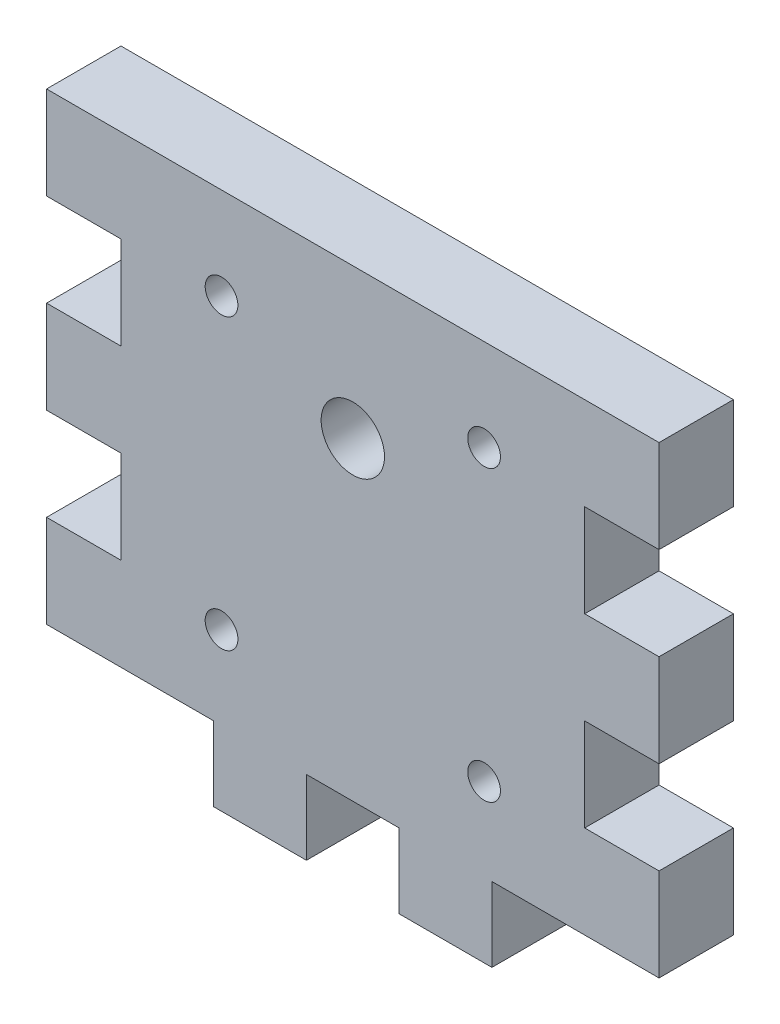
ISO-10303-21;
HEADER;
FILE_DESCRIPTION(('STEP AP214'),'2;1');
FILE_NAME('part.step','',(''),(''),'','','');
FILE_SCHEMA(('AUTOMOTIVE_DESIGN { 1 0 10303 214 1 1 1 1 }'));
ENDSEC;
DATA;
#1=APPLICATION_CONTEXT('core data for automotive mechanical design processes');
#2=APPLICATION_PROTOCOL_DEFINITION('international standard','automotive_design',2000,#1);
#3=PRODUCT_CONTEXT('',#1,'mechanical');
#4=PRODUCT('Part','Part','',(#3));
#5=PRODUCT_RELATED_PRODUCT_CATEGORY('part','',(#4));
#6=PRODUCT_DEFINITION_FORMATION('','',#4);
#7=PRODUCT_DEFINITION_CONTEXT('part definition',#1,'design');
#8=PRODUCT_DEFINITION('design','',#6,#7);
#9=PRODUCT_DEFINITION_SHAPE('','',#8);
#10=(LENGTH_UNIT() NAMED_UNIT(*) SI_UNIT(.MILLI.,.METRE.));
#11=(NAMED_UNIT(*) PLANE_ANGLE_UNIT() SI_UNIT($,.RADIAN.));
#12=(NAMED_UNIT(*) SI_UNIT($,.STERADIAN.) SOLID_ANGLE_UNIT());
#13=UNCERTAINTY_MEASURE_WITH_UNIT(LENGTH_MEASURE(1.E-05),#10,'distance_accuracy_value','');
#14=(GEOMETRIC_REPRESENTATION_CONTEXT(3) GLOBAL_UNCERTAINTY_ASSIGNED_CONTEXT((#13)) GLOBAL_UNIT_ASSIGNED_CONTEXT((#10,
#11,#12)) REPRESENTATION_CONTEXT('',''));
#15=CARTESIAN_POINT('',(0.,0.,0.));
#16=DIRECTION('',(0.,0.,1.));
#17=DIRECTION('',(1.,0.,0.));
#18=AXIS2_PLACEMENT_3D('',#15,#16,#17);
#19=CARTESIAN_POINT('',(0.,0.,6.35));
#20=DIRECTION('',(0.,0.,-1.));
#21=DIRECTION('',(-1.,0.,0.));
#22=AXIS2_PLACEMENT_3D('',#19,#20,#21);
#23=PLANE('',#22);
#24=CARTESIAN_POINT('',(3.22086547923458,-25.1066840960137,6.35));
#25=DIRECTION('',(0.,0.,1.));
#26=DIRECTION('',(1.,0.,0.));
#27=AXIS2_PLACEMENT_3D('',#24,#25,#26);
#28=CIRCLE('',#27,1.397);
#29=CARTESIAN_POINT('',(4.61786547923458,-25.1066840960137,6.35));
#30=VERTEX_POINT('',#29);
#31=EDGE_CURVE('E506',#30,#30,#28,.T.);
#32=ORIENTED_EDGE('',*,*,#31,.F.);
#33=EDGE_LOOP('',(#32));
#34=FACE_BOUND('',#33,.T.);
#35=CARTESIAN_POINT('',(25.6363977372346,-0.422913296013645,6.35));
#36=DIRECTION('',(0.,0.,1.));
#37=DIRECTION('',(1.,0.,0.));
#38=AXIS2_PLACEMENT_3D('',#35,#36,#37);
#39=CIRCLE('',#38,1.397);
#40=CARTESIAN_POINT('',(27.0333977372346,-0.422913296013645,6.35));
#41=VERTEX_POINT('',#40);
#42=EDGE_CURVE('E518',#41,#41,#39,.T.);
#43=ORIENTED_EDGE('',*,*,#42,.F.);
#44=EDGE_LOOP('',(#43));
#45=FACE_BOUND('',#44,.T.);
#46=DIRECTION('',(1.,0.,0.));
#47=VECTOR('',#46,1.);
#48=CARTESIAN_POINT('',(2.55226427643458,-38.5282508520136,6.35));
#49=LINE('',#48,#47);
#50=CARTESIAN_POINT('',(2.55226427643458,-38.5282508520136,6.35));
#51=VERTEX_POINT('',#50);
#52=CARTESIAN_POINT('',(10.4698424976346,-38.5282508520136,6.35));
#53=VERTEX_POINT('',#52);
#54=EDGE_CURVE('E307',#51,#53,#49,.T.);
#55=ORIENTED_EDGE('',*,*,#54,.T.);
#56=DIRECTION('',(0.,1.,0.));
#57=VECTOR('',#56,1.);
#58=CARTESIAN_POINT('',(10.4698424976346,-32.1782508520136,6.35));
#59=LINE('',#58,#57);
#60=CARTESIAN_POINT('',(10.4698424976346,-32.1782508520136,6.35));
#61=VERTEX_POINT('',#60);
#62=EDGE_CURVE('E153',#53,#61,#59,.T.);
#63=ORIENTED_EDGE('',*,*,#62,.T.);
#64=DIRECTION('',(1.,0.,0.));
#65=VECTOR('',#64,1.);
#66=CARTESIAN_POINT('',(10.4698424976346,-32.1782508520136,6.35));
#67=LINE('',#66,#65);
#68=CARTESIAN_POINT('',(18.3874207188346,-32.1782508520136,6.35));
#69=VERTEX_POINT('',#68);
#70=EDGE_CURVE('E382',#61,#69,#67,.T.);
#71=ORIENTED_EDGE('',*,*,#70,.T.);
#72=DIRECTION('',(0.,-1.,0.));
#73=VECTOR('',#72,1.);
#74=CARTESIAN_POINT('',(18.3874207188346,-32.1782508520136,6.35));
#75=LINE('',#74,#73);
#76=CARTESIAN_POINT('',(18.3874207188346,-38.5282508520136,6.35));
#77=VERTEX_POINT('',#76);
#78=EDGE_CURVE('E401',#69,#77,#75,.T.);
#79=ORIENTED_EDGE('',*,*,#78,.T.);
#80=DIRECTION('',(1.,0.,0.));
#81=VECTOR('',#80,1.);
#82=CARTESIAN_POINT('',(18.3874207188346,-38.5282508520136,6.35));
#83=LINE('',#82,#81);
#84=CARTESIAN_POINT('',(26.3049989400346,-38.5282508520136,6.35));
#85=VERTEX_POINT('',#84);
#86=EDGE_CURVE('E398',#77,#85,#83,.T.);
#87=ORIENTED_EDGE('',*,*,#86,.T.);
#88=DIRECTION('',(0.,1.,0.));
#89=VECTOR('',#88,1.);
#90=CARTESIAN_POINT('',(26.3049989400346,-32.1782508520136,6.35));
#91=LINE('',#90,#89);
#92=CARTESIAN_POINT('',(26.3049989400346,-32.1782508520136,6.35));
#93=VERTEX_POINT('',#92);
#94=EDGE_CURVE('E400',#85,#93,#91,.T.);
#95=ORIENTED_EDGE('',*,*,#94,.T.);
#96=DIRECTION('',(1.,0.,0.));
#97=VECTOR('',#96,1.);
#98=CARTESIAN_POINT('',(26.3049989400346,-32.1782508520136,6.35));
#99=LINE('',#98,#97);
#100=CARTESIAN_POINT('',(40.5725771612346,-32.1782508520136,6.35));
#101=VERTEX_POINT('',#100);
#102=EDGE_CURVE('E403',#93,#101,#99,.T.);
#103=ORIENTED_EDGE('',*,*,#102,.T.);
#104=DIRECTION('',(0.,1.,0.));
#105=VECTOR('',#104,1.);
#106=CARTESIAN_POINT('',(40.5725771612346,-24.2606726308136,6.35));
#107=LINE('',#106,#105);
#108=CARTESIAN_POINT('',(40.5725771612346,-24.2606726308136,6.35));
#109=VERTEX_POINT('',#108);
#110=EDGE_CURVE('E409',#101,#109,#107,.T.);
#111=ORIENTED_EDGE('',*,*,#110,.T.);
#112=DIRECTION('',(-1.,0.,0.));
#113=VECTOR('',#112,1.);
#114=CARTESIAN_POINT('',(34.2225771612346,-24.2606726308136,6.35));
#115=LINE('',#114,#113);
#116=CARTESIAN_POINT('',(34.2225771612346,-24.2606726308136,6.35));
#117=VERTEX_POINT('',#116);
#118=EDGE_CURVE('E411',#109,#117,#115,.T.);
#119=ORIENTED_EDGE('',*,*,#118,.T.);
#120=DIRECTION('',(0.,1.,0.));
#121=VECTOR('',#120,1.);
#122=CARTESIAN_POINT('',(34.2225771612346,-16.3430944096136,6.35));
#123=LINE('',#122,#121);
#124=CARTESIAN_POINT('',(34.2225771612346,-16.3430944096136,6.35));
#125=VERTEX_POINT('',#124);
#126=EDGE_CURVE('E413',#117,#125,#123,.T.);
#127=ORIENTED_EDGE('',*,*,#126,.T.);
#128=DIRECTION('',(1.,0.,0.));
#129=VECTOR('',#128,1.);
#130=CARTESIAN_POINT('',(34.2225771612346,-16.3430944096136,6.35));
#131=LINE('',#130,#129);
#132=CARTESIAN_POINT('',(40.5725771612346,-16.3430944096136,6.35));
#133=VERTEX_POINT('',#132);
#134=EDGE_CURVE('E415',#125,#133,#131,.T.);
#135=ORIENTED_EDGE('',*,*,#134,.T.);
#136=DIRECTION('',(0.,1.,0.));
#137=VECTOR('',#136,1.);
#138=CARTESIAN_POINT('',(40.5725771612346,-8.42551618841362,6.35));
#139=LINE('',#138,#137);
#140=CARTESIAN_POINT('',(40.5725771612346,-8.42551618841362,6.35));
#141=VERTEX_POINT('',#140);
#142=EDGE_CURVE('E417',#133,#141,#139,.T.);
#143=ORIENTED_EDGE('',*,*,#142,.T.);
#144=DIRECTION('',(-1.,0.,0.));
#145=VECTOR('',#144,1.);
#146=CARTESIAN_POINT('',(34.2225771612346,-8.42551618841362,6.35));
#147=LINE('',#146,#145);
#148=CARTESIAN_POINT('',(34.2225771612346,-8.42551618841362,6.35));
#149=VERTEX_POINT('',#148);
#150=EDGE_CURVE('E419',#141,#149,#147,.T.);
#151=ORIENTED_EDGE('',*,*,#150,.T.);
#152=DIRECTION('',(0.,1.,0.));
#153=VECTOR('',#152,1.);
#154=CARTESIAN_POINT('',(34.2225771612346,-0.507937967213606,6.35));
#155=LINE('',#154,#153);
#156=CARTESIAN_POINT('',(34.2225771612346,-0.507937967213606,6.35));
#157=VERTEX_POINT('',#156);
#158=EDGE_CURVE('E421',#149,#157,#155,.T.);
#159=ORIENTED_EDGE('',*,*,#158,.T.);
#160=DIRECTION('',(1.,0.,0.));
#161=VECTOR('',#160,1.);
#162=CARTESIAN_POINT('',(34.2225771612346,-0.507937967213606,6.35));
#163=LINE('',#162,#161);
#164=CARTESIAN_POINT('',(40.5725771612346,-0.507937967213622,6.35));
#165=VERTEX_POINT('',#164);
#166=EDGE_CURVE('E423',#157,#165,#163,.T.);
#167=ORIENTED_EDGE('',*,*,#166,.T.);
#168=DIRECTION('',(0.,1.,0.));
#169=VECTOR('',#168,1.);
#170=CARTESIAN_POINT('',(40.5725771612346,7.40964025398638,6.35));
#171=LINE('',#170,#169);
#172=CARTESIAN_POINT('',(40.5725771612346,7.40964025398638,6.35));
#173=VERTEX_POINT('',#172);
#174=EDGE_CURVE('E425',#165,#173,#171,.T.);
#175=ORIENTED_EDGE('',*,*,#174,.T.);
#176=DIRECTION('',(-1.,0.,0.));
#177=VECTOR('',#176,1.);
#178=CARTESIAN_POINT('',(-11.7153139447654,7.40964025398638,6.35));
#179=LINE('',#178,#177);
#180=CARTESIAN_POINT('',(-11.7153139447654,7.40964025398638,6.35));
#181=VERTEX_POINT('',#180);
#182=EDGE_CURVE('E427',#173,#181,#179,.T.);
#183=ORIENTED_EDGE('',*,*,#182,.T.);
#184=DIRECTION('',(0.,-1.,0.));
#185=VECTOR('',#184,1.);
#186=CARTESIAN_POINT('',(-11.7153139447654,7.40964025398638,6.35));
#187=LINE('',#186,#185);
#188=CARTESIAN_POINT('',(-11.7153139447654,-0.507937967213622,6.35));
#189=VERTEX_POINT('',#188);
#190=EDGE_CURVE('E429',#181,#189,#187,.T.);
#191=ORIENTED_EDGE('',*,*,#190,.T.);
#192=DIRECTION('',(1.,0.,0.));
#193=VECTOR('',#192,1.);
#194=CARTESIAN_POINT('',(-5.36531394476542,-0.507937967213605,6.35));
#195=LINE('',#194,#193);
#196=CARTESIAN_POINT('',(-5.36531394476542,-0.507937967213605,6.35));
#197=VERTEX_POINT('',#196);
#198=EDGE_CURVE('E431',#189,#197,#195,.T.);
#199=ORIENTED_EDGE('',*,*,#198,.T.);
#200=DIRECTION('',(0.,-1.,0.));
#201=VECTOR('',#200,1.);
#202=CARTESIAN_POINT('',(-5.36531394476542,-0.507937967213605,6.35));
#203=LINE('',#202,#201);
#204=CARTESIAN_POINT('',(-5.36531394476542,-8.42551618841362,6.35));
#205=VERTEX_POINT('',#204);
#206=EDGE_CURVE('E433',#197,#205,#203,.T.);
#207=ORIENTED_EDGE('',*,*,#206,.T.);
#208=DIRECTION('',(-1.,0.,0.));
#209=VECTOR('',#208,1.);
#210=CARTESIAN_POINT('',(-5.36531394476542,-8.42551618841362,6.35));
#211=LINE('',#210,#209);
#212=CARTESIAN_POINT('',(-11.7153139447654,-8.42551618841362,6.35));
#213=VERTEX_POINT('',#212);
#214=EDGE_CURVE('E435',#205,#213,#211,.T.);
#215=ORIENTED_EDGE('',*,*,#214,.T.);
#216=DIRECTION('',(0.,-1.,0.));
#217=VECTOR('',#216,1.);
#218=CARTESIAN_POINT('',(-11.7153139447654,-16.3430944096136,6.35));
#219=LINE('',#218,#217);
#220=CARTESIAN_POINT('',(-11.7153139447654,-16.3430944096136,6.35));
#221=VERTEX_POINT('',#220);
#222=EDGE_CURVE('E437',#213,#221,#219,.T.);
#223=ORIENTED_EDGE('',*,*,#222,.T.);
#224=DIRECTION('',(1.,0.,0.));
#225=VECTOR('',#224,1.);
#226=CARTESIAN_POINT('',(-5.36531394476542,-16.3430944096136,6.35));
#227=LINE('',#226,#225);
#228=CARTESIAN_POINT('',(-5.36531394476542,-16.3430944096136,6.35));
#229=VERTEX_POINT('',#228);
#230=EDGE_CURVE('E439',#221,#229,#227,.T.);
#231=ORIENTED_EDGE('',*,*,#230,.T.);
#232=DIRECTION('',(0.,-1.,0.));
#233=VECTOR('',#232,1.);
#234=CARTESIAN_POINT('',(-5.36531394476542,-16.3430944096136,6.35));
#235=LINE('',#234,#233);
#236=CARTESIAN_POINT('',(-5.36531394476542,-24.2606726308136,6.35));
#237=VERTEX_POINT('',#236);
#238=EDGE_CURVE('E441',#229,#237,#235,.T.);
#239=ORIENTED_EDGE('',*,*,#238,.T.);
#240=DIRECTION('',(-1.,0.,0.));
#241=VECTOR('',#240,1.);
#242=CARTESIAN_POINT('',(-5.36531394476542,-24.2606726308136,6.35));
#243=LINE('',#242,#241);
#244=CARTESIAN_POINT('',(-11.7153139447654,-24.2606726308136,6.35));
#245=VERTEX_POINT('',#244);
#246=EDGE_CURVE('E232',#237,#245,#243,.T.);
#247=ORIENTED_EDGE('',*,*,#246,.T.);
#248=DIRECTION('',(0.,-1.,0.));
#249=VECTOR('',#248,1.);
#250=CARTESIAN_POINT('',(-11.7153139447654,-32.1782508520136,6.35));
#251=LINE('',#250,#249);
#252=CARTESIAN_POINT('',(-11.7153139447654,-32.1782508520136,6.35));
#253=VERTEX_POINT('',#252);
#254=EDGE_CURVE('E226',#245,#253,#251,.T.);
#255=ORIENTED_EDGE('',*,*,#254,.T.);
#256=DIRECTION('',(1.,0.,0.));
#257=VECTOR('',#256,1.);
#258=CARTESIAN_POINT('',(-5.36531394476542,-32.1782508520136,6.35));
#259=LINE('',#258,#257);
#260=CARTESIAN_POINT('',(2.55226427643458,-32.1782508520136,6.35));
#261=VERTEX_POINT('',#260);
#262=EDGE_CURVE('E230',#253,#261,#259,.T.);
#263=ORIENTED_EDGE('',*,*,#262,.T.);
#264=DIRECTION('',(0.,-1.,0.));
#265=VECTOR('',#264,1.);
#266=CARTESIAN_POINT('',(2.55226427643458,-38.5282508520136,6.35));
#267=LINE('',#266,#265);
#268=EDGE_CURVE('E51',#261,#51,#267,.T.);
#269=ORIENTED_EDGE('',*,*,#268,.T.);
#270=EDGE_LOOP('',(#55,#63,#71,#79,#87,#95,#103,#111,#119,#127,#135,#143,#151,#159,#167,#175,
#183,#191,#199,#207,#215,#223,#231,#239,#247,#255,#263,#269));
#271=FACE_BOUND('',#270,.T.);
#272=CARTESIAN_POINT('',(3.22086547923459,-0.422913296013645,6.35));
#273=DIRECTION('',(0.,0.,1.));
#274=DIRECTION('',(1.,0.,0.));
#275=AXIS2_PLACEMENT_3D('',#272,#273,#274);
#276=CIRCLE('',#275,1.397);
#277=CARTESIAN_POINT('',(4.61786547923459,-0.422913296013645,6.35));
#278=VERTEX_POINT('',#277);
#279=EDGE_CURVE('E255',#278,#278,#276,.T.);
#280=ORIENTED_EDGE('',*,*,#279,.F.);
#281=EDGE_LOOP('',(#280));
#282=FACE_BOUND('',#281,.T.);
#283=CARTESIAN_POINT('',(25.6363977372346,-25.1066840960137,6.35));
#284=DIRECTION('',(0.,0.,1.));
#285=DIRECTION('',(1.,0.,0.));
#286=AXIS2_PLACEMENT_3D('',#283,#284,#285);
#287=CIRCLE('',#286,1.397);
#288=CARTESIAN_POINT('',(27.0333977372346,-25.1066840960137,6.35));
#289=VERTEX_POINT('',#288);
#290=EDGE_CURVE('E512',#289,#289,#287,.T.);
#291=ORIENTED_EDGE('',*,*,#290,.F.);
#292=EDGE_LOOP('',(#291));
#293=FACE_BOUND('',#292,.T.);
#294=CARTESIAN_POINT('',(14.4286316082346,-5.35966745601365,6.35));
#295=DIRECTION('',(0.,0.,1.));
#296=DIRECTION('',(1.,0.,0.));
#297=AXIS2_PLACEMENT_3D('',#294,#295,#296);
#298=CIRCLE('',#297,2.70409387831448);
#299=CARTESIAN_POINT('',(17.1327254865491,-5.35966745601365,6.35));
#300=VERTEX_POINT('',#299);
#301=EDGE_CURVE('E497',#300,#300,#298,.T.);
#302=ORIENTED_EDGE('',*,*,#301,.F.);
#303=EDGE_LOOP('',(#302));
#304=FACE_BOUND('',#303,.T.);
#305=ADVANCED_FACE('F34',(#34,#45,#271,#282,#293,#304),#23,.F.);
#306=CARTESIAN_POINT('',(0.,0.,0.));
#307=DIRECTION('',(0.,0.,-1.));
#308=DIRECTION('',(-1.,0.,0.));
#309=AXIS2_PLACEMENT_3D('',#306,#307,#308);
#310=PLANE('',#309);
#311=CARTESIAN_POINT('',(3.22086547923458,-25.1066840960137,0.));
#312=DIRECTION('',(0.,0.,1.));
#313=DIRECTION('',(1.,0.,0.));
#314=AXIS2_PLACEMENT_3D('',#311,#312,#313);
#315=CIRCLE('',#314,1.397);
#316=CARTESIAN_POINT('',(4.61786547923458,-25.1066840960137,0.));
#317=VERTEX_POINT('',#316);
#318=EDGE_CURVE('E503',#317,#317,#315,.T.);
#319=ORIENTED_EDGE('',*,*,#318,.T.);
#320=EDGE_LOOP('',(#319));
#321=FACE_BOUND('',#320,.T.);
#322=CARTESIAN_POINT('',(25.6363977372346,-0.422913296013645,0.));
#323=DIRECTION('',(0.,0.,1.));
#324=DIRECTION('',(1.,0.,0.));
#325=AXIS2_PLACEMENT_3D('',#322,#323,#324);
#326=CIRCLE('',#325,1.397);
#327=CARTESIAN_POINT('',(27.0333977372346,-0.422913296013645,0.));
#328=VERTEX_POINT('',#327);
#329=EDGE_CURVE('E515',#328,#328,#326,.T.);
#330=ORIENTED_EDGE('',*,*,#329,.T.);
#331=EDGE_LOOP('',(#330));
#332=FACE_BOUND('',#331,.T.);
#333=DIRECTION('',(1.,0.,0.));
#334=VECTOR('',#333,1.);
#335=CARTESIAN_POINT('',(2.55226427643458,-38.5282508520136,0.));
#336=LINE('',#335,#334);
#337=CARTESIAN_POINT('',(2.55226427643458,-38.5282508520136,0.));
#338=VERTEX_POINT('',#337);
#339=CARTESIAN_POINT('',(10.4698424976346,-38.5282508520136,0.));
#340=VERTEX_POINT('',#339);
#341=EDGE_CURVE('E251',#338,#340,#336,.T.);
#342=ORIENTED_EDGE('',*,*,#341,.F.);
#343=DIRECTION('',(0.,-1.,0.));
#344=VECTOR('',#343,1.);
#345=CARTESIAN_POINT('',(2.55226427643458,-38.5282508520136,0.));
#346=LINE('',#345,#344);
#347=CARTESIAN_POINT('',(2.55226427643458,-32.1782508520136,0.));
#348=VERTEX_POINT('',#347);
#349=EDGE_CURVE('E145',#348,#338,#346,.T.);
#350=ORIENTED_EDGE('',*,*,#349,.F.);
#351=DIRECTION('',(1.,0.,0.));
#352=VECTOR('',#351,1.);
#353=CARTESIAN_POINT('',(2.55226427643458,-32.1782508520136,0.));
#354=LINE('',#353,#352);
#355=CARTESIAN_POINT('',(-11.7153139447654,-32.1782508520136,0.));
#356=VERTEX_POINT('',#355);
#357=EDGE_CURVE('E139',#356,#348,#354,.T.);
#358=ORIENTED_EDGE('',*,*,#357,.F.);
#359=DIRECTION('',(0.,-1.,0.));
#360=VECTOR('',#359,1.);
#361=CARTESIAN_POINT('',(-11.7153139447654,-32.1782508520136,0.));
#362=LINE('',#361,#360);
#363=CARTESIAN_POINT('',(-11.7153139447654,-24.2606726308136,0.));
#364=VERTEX_POINT('',#363);
#365=EDGE_CURVE('E241',#364,#356,#362,.T.);
#366=ORIENTED_EDGE('',*,*,#365,.F.);
#367=DIRECTION('',(-1.,0.,0.));
#368=VECTOR('',#367,1.);
#369=CARTESIAN_POINT('',(-5.36531394476542,-24.2606726308136,0.));
#370=LINE('',#369,#368);
#371=CARTESIAN_POINT('',(-5.36531394476542,-24.2606726308136,0.));
#372=VERTEX_POINT('',#371);
#373=EDGE_CURVE('E302',#372,#364,#370,.T.);
#374=ORIENTED_EDGE('',*,*,#373,.F.);
#375=DIRECTION('',(0.,-1.,0.));
#376=VECTOR('',#375,1.);
#377=CARTESIAN_POINT('',(-5.36531394476542,-16.3430944096136,0.));
#378=LINE('',#377,#376);
#379=CARTESIAN_POINT('',(-5.36531394476542,-16.3430944096136,0.));
#380=VERTEX_POINT('',#379);
#381=EDGE_CURVE('E300',#380,#372,#378,.T.);
#382=ORIENTED_EDGE('',*,*,#381,.F.);
#383=DIRECTION('',(1.,0.,0.));
#384=VECTOR('',#383,1.);
#385=CARTESIAN_POINT('',(-5.36531394476542,-16.3430944096136,0.));
#386=LINE('',#385,#384);
#387=CARTESIAN_POINT('',(-11.7153139447654,-16.3430944096136,0.));
#388=VERTEX_POINT('',#387);
#389=EDGE_CURVE('E298',#388,#380,#386,.T.);
#390=ORIENTED_EDGE('',*,*,#389,.F.);
#391=DIRECTION('',(0.,-1.,0.));
#392=VECTOR('',#391,1.);
#393=CARTESIAN_POINT('',(-11.7153139447654,-16.3430944096136,0.));
#394=LINE('',#393,#392);
#395=CARTESIAN_POINT('',(-11.7153139447654,-8.42551618841362,0.));
#396=VERTEX_POINT('',#395);
#397=EDGE_CURVE('E296',#396,#388,#394,.T.);
#398=ORIENTED_EDGE('',*,*,#397,.F.);
#399=DIRECTION('',(-1.,0.,0.));
#400=VECTOR('',#399,1.);
#401=CARTESIAN_POINT('',(-5.36531394476542,-8.42551618841362,0.));
#402=LINE('',#401,#400);
#403=CARTESIAN_POINT('',(-5.36531394476542,-8.42551618841362,0.));
#404=VERTEX_POINT('',#403);
#405=EDGE_CURVE('E294',#404,#396,#402,.T.);
#406=ORIENTED_EDGE('',*,*,#405,.F.);
#407=DIRECTION('',(0.,-1.,0.));
#408=VECTOR('',#407,1.);
#409=CARTESIAN_POINT('',(-5.36531394476542,-0.507937967213605,0.));
#410=LINE('',#409,#408);
#411=CARTESIAN_POINT('',(-5.36531394476542,-0.507937967213605,0.));
#412=VERTEX_POINT('',#411);
#413=EDGE_CURVE('E292',#412,#404,#410,.T.);
#414=ORIENTED_EDGE('',*,*,#413,.F.);
#415=DIRECTION('',(1.,0.,0.));
#416=VECTOR('',#415,1.);
#417=CARTESIAN_POINT('',(-5.36531394476542,-0.507937967213605,0.));
#418=LINE('',#417,#416);
#419=CARTESIAN_POINT('',(-11.7153139447654,-0.507937967213622,0.));
#420=VERTEX_POINT('',#419);
#421=EDGE_CURVE('E290',#420,#412,#418,.T.);
#422=ORIENTED_EDGE('',*,*,#421,.F.);
#423=DIRECTION('',(0.,-1.,0.));
#424=VECTOR('',#423,1.);
#425=CARTESIAN_POINT('',(-11.7153139447654,7.40964025398638,0.));
#426=LINE('',#425,#424);
#427=CARTESIAN_POINT('',(-11.7153139447654,7.40964025398638,0.));
#428=VERTEX_POINT('',#427);
#429=EDGE_CURVE('E288',#428,#420,#426,.T.);
#430=ORIENTED_EDGE('',*,*,#429,.F.);
#431=DIRECTION('',(-1.,0.,0.));
#432=VECTOR('',#431,1.);
#433=CARTESIAN_POINT('',(-11.7153139447654,7.40964025398638,0.));
#434=LINE('',#433,#432);
#435=CARTESIAN_POINT('',(40.5725771612346,7.40964025398638,0.));
#436=VERTEX_POINT('',#435);
#437=EDGE_CURVE('E286',#436,#428,#434,.T.);
#438=ORIENTED_EDGE('',*,*,#437,.F.);
#439=DIRECTION('',(0.,1.,0.));
#440=VECTOR('',#439,1.);
#441=CARTESIAN_POINT('',(40.5725771612346,7.40964025398638,0.));
#442=LINE('',#441,#440);
#443=CARTESIAN_POINT('',(40.5725771612346,-0.507937967213622,0.));
#444=VERTEX_POINT('',#443);
#445=EDGE_CURVE('E284',#444,#436,#442,.T.);
#446=ORIENTED_EDGE('',*,*,#445,.F.);
#447=DIRECTION('',(1.,0.,0.));
#448=VECTOR('',#447,1.);
#449=CARTESIAN_POINT('',(34.2225771612346,-0.507937967213606,0.));
#450=LINE('',#449,#448);
#451=CARTESIAN_POINT('',(34.2225771612346,-0.507937967213606,0.));
#452=VERTEX_POINT('',#451);
#453=EDGE_CURVE('E282',#452,#444,#450,.T.);
#454=ORIENTED_EDGE('',*,*,#453,.F.);
#455=DIRECTION('',(0.,1.,0.));
#456=VECTOR('',#455,1.);
#457=CARTESIAN_POINT('',(34.2225771612346,-0.507937967213606,0.));
#458=LINE('',#457,#456);
#459=CARTESIAN_POINT('',(34.2225771612346,-8.42551618841362,0.));
#460=VERTEX_POINT('',#459);
#461=EDGE_CURVE('E280',#460,#452,#458,.T.);
#462=ORIENTED_EDGE('',*,*,#461,.F.);
#463=DIRECTION('',(-1.,0.,0.));
#464=VECTOR('',#463,1.);
#465=CARTESIAN_POINT('',(34.2225771612346,-8.42551618841362,0.));
#466=LINE('',#465,#464);
#467=CARTESIAN_POINT('',(40.5725771612346,-8.42551618841362,0.));
#468=VERTEX_POINT('',#467);
#469=EDGE_CURVE('E278',#468,#460,#466,.T.);
#470=ORIENTED_EDGE('',*,*,#469,.F.);
#471=DIRECTION('',(0.,1.,0.));
#472=VECTOR('',#471,1.);
#473=CARTESIAN_POINT('',(40.5725771612346,-8.42551618841362,0.));
#474=LINE('',#473,#472);
#475=CARTESIAN_POINT('',(40.5725771612346,-16.3430944096136,0.));
#476=VERTEX_POINT('',#475);
#477=EDGE_CURVE('E276',#476,#468,#474,.T.);
#478=ORIENTED_EDGE('',*,*,#477,.F.);
#479=DIRECTION('',(1.,0.,0.));
#480=VECTOR('',#479,1.);
#481=CARTESIAN_POINT('',(34.2225771612346,-16.3430944096136,0.));
#482=LINE('',#481,#480);
#483=CARTESIAN_POINT('',(34.2225771612346,-16.3430944096136,0.));
#484=VERTEX_POINT('',#483);
#485=EDGE_CURVE('E274',#484,#476,#482,.T.);
#486=ORIENTED_EDGE('',*,*,#485,.F.);
#487=DIRECTION('',(0.,1.,0.));
#488=VECTOR('',#487,1.);
#489=CARTESIAN_POINT('',(34.2225771612346,-16.3430944096136,0.));
#490=LINE('',#489,#488);
#491=CARTESIAN_POINT('',(34.2225771612346,-24.2606726308136,0.));
#492=VERTEX_POINT('',#491);
#493=EDGE_CURVE('E272',#492,#484,#490,.T.);
#494=ORIENTED_EDGE('',*,*,#493,.F.);
#495=DIRECTION('',(-1.,0.,0.));
#496=VECTOR('',#495,1.);
#497=CARTESIAN_POINT('',(34.2225771612346,-24.2606726308136,0.));
#498=LINE('',#497,#496);
#499=CARTESIAN_POINT('',(40.5725771612346,-24.2606726308136,0.));
#500=VERTEX_POINT('',#499);
#501=EDGE_CURVE('E270',#500,#492,#498,.T.);
#502=ORIENTED_EDGE('',*,*,#501,.F.);
#503=DIRECTION('',(0.,1.,0.));
#504=VECTOR('',#503,1.);
#505=CARTESIAN_POINT('',(40.5725771612346,-24.2606726308136,0.));
#506=LINE('',#505,#504);
#507=CARTESIAN_POINT('',(40.5725771612346,-32.1782508520136,0.));
#508=VERTEX_POINT('',#507);
#509=EDGE_CURVE('E268',#508,#500,#506,.T.);
#510=ORIENTED_EDGE('',*,*,#509,.F.);
#511=DIRECTION('',(1.,0.,0.));
#512=VECTOR('',#511,1.);
#513=CARTESIAN_POINT('',(34.2225771612346,-32.1782508520136,0.));
#514=LINE('',#513,#512);
#515=CARTESIAN_POINT('',(26.3049989400346,-32.1782508520136,0.));
#516=VERTEX_POINT('',#515);
#517=EDGE_CURVE('E266',#516,#508,#514,.T.);
#518=ORIENTED_EDGE('',*,*,#517,.F.);
#519=DIRECTION('',(0.,1.,0.));
#520=VECTOR('',#519,1.);
#521=CARTESIAN_POINT('',(26.3049989400346,-32.1782508520136,0.));
#522=LINE('',#521,#520);
#523=CARTESIAN_POINT('',(26.3049989400346,-38.5282508520136,0.));
#524=VERTEX_POINT('',#523);
#525=EDGE_CURVE('E263',#524,#516,#522,.T.);
#526=ORIENTED_EDGE('',*,*,#525,.F.);
#527=DIRECTION('',(1.,0.,0.));
#528=VECTOR('',#527,1.);
#529=CARTESIAN_POINT('',(18.3874207188346,-38.5282508520136,0.));
#530=LINE('',#529,#528);
#531=CARTESIAN_POINT('',(18.3874207188346,-38.5282508520136,0.));
#532=VERTEX_POINT('',#531);
#533=EDGE_CURVE('E261',#532,#524,#530,.T.);
#534=ORIENTED_EDGE('',*,*,#533,.F.);
#535=DIRECTION('',(0.,-1.,0.));
#536=VECTOR('',#535,1.);
#537=CARTESIAN_POINT('',(18.3874207188346,-32.1782508520136,0.));
#538=LINE('',#537,#536);
#539=CARTESIAN_POINT('',(18.3874207188346,-32.1782508520136,0.));
#540=VERTEX_POINT('',#539);
#541=EDGE_CURVE('E259',#540,#532,#538,.T.);
#542=ORIENTED_EDGE('',*,*,#541,.F.);
#543=DIRECTION('',(1.,0.,0.));
#544=VECTOR('',#543,1.);
#545=CARTESIAN_POINT('',(10.4698424976346,-32.1782508520136,0.));
#546=LINE('',#545,#544);
#547=CARTESIAN_POINT('',(10.4698424976346,-32.1782508520136,0.));
#548=VERTEX_POINT('',#547);
#549=EDGE_CURVE('E257',#548,#540,#546,.T.);
#550=ORIENTED_EDGE('',*,*,#549,.F.);
#551=DIRECTION('',(0.,1.,0.));
#552=VECTOR('',#551,1.);
#553=CARTESIAN_POINT('',(10.4698424976346,-32.1782508520136,0.));
#554=LINE('',#553,#552);
#555=EDGE_CURVE('E254',#340,#548,#554,.T.);
#556=ORIENTED_EDGE('',*,*,#555,.F.);
#557=EDGE_LOOP('',(#342,#350,#358,#366,#374,#382,#390,#398,#406,#414,#422,#430,#438,#446,#454,
#462,#470,#478,#486,#494,#502,#510,#518,#526,#534,#542,#550,#556));
#558=FACE_BOUND('',#557,.T.);
#559=CARTESIAN_POINT('',(3.22086547923459,-0.422913296013645,0.));
#560=DIRECTION('',(0.,0.,1.));
#561=DIRECTION('',(1.,0.,0.));
#562=AXIS2_PLACEMENT_3D('',#559,#560,#561);
#563=CIRCLE('',#562,1.397);
#564=CARTESIAN_POINT('',(4.61786547923459,-0.422913296013645,0.));
#565=VERTEX_POINT('',#564);
#566=EDGE_CURVE('E521',#565,#565,#563,.T.);
#567=ORIENTED_EDGE('',*,*,#566,.T.);
#568=EDGE_LOOP('',(#567));
#569=FACE_BOUND('',#568,.T.);
#570=CARTESIAN_POINT('',(25.6363977372346,-25.1066840960137,0.));
#571=DIRECTION('',(0.,0.,1.));
#572=DIRECTION('',(1.,0.,0.));
#573=AXIS2_PLACEMENT_3D('',#570,#571,#572);
#574=CIRCLE('',#573,1.397);
#575=CARTESIAN_POINT('',(27.0333977372346,-25.1066840960137,0.));
#576=VERTEX_POINT('',#575);
#577=EDGE_CURVE('E509',#576,#576,#574,.T.);
#578=ORIENTED_EDGE('',*,*,#577,.T.);
#579=EDGE_LOOP('',(#578));
#580=FACE_BOUND('',#579,.T.);
#581=CARTESIAN_POINT('',(14.4286316082346,-5.35966745601365,0.));
#582=DIRECTION('',(0.,0.,1.));
#583=DIRECTION('',(1.,0.,0.));
#584=AXIS2_PLACEMENT_3D('',#581,#582,#583);
#585=CIRCLE('',#584,2.70409387831448);
#586=CARTESIAN_POINT('',(17.1327254865491,-5.35966745601365,0.));
#587=VERTEX_POINT('',#586);
#588=EDGE_CURVE('E500',#587,#587,#585,.T.);
#589=ORIENTED_EDGE('',*,*,#588,.T.);
#590=EDGE_LOOP('',(#589));
#591=FACE_BOUND('',#590,.T.);
#592=ADVANCED_FACE('F386',(#321,#332,#558,#569,#580,#591),#310,.T.);
#593=CARTESIAN_POINT('',(2.55226427643458,-38.5282508520136,6.35));
#594=DIRECTION('',(0.,1.,0.));
#595=DIRECTION('',(0.,0.,1.));
#596=AXIS2_PLACEMENT_3D('',#593,#594,#595);
#597=PLANE('',#596);
#598=ORIENTED_EDGE('',*,*,#341,.T.);
#599=DIRECTION('',(0.,0.,-1.));
#600=VECTOR('',#599,1.);
#601=CARTESIAN_POINT('',(10.4698424976346,-38.5282508520136,6.35));
#602=LINE('',#601,#600);
#603=EDGE_CURVE('E11',#53,#340,#602,.T.);
#604=ORIENTED_EDGE('',*,*,#603,.F.);
#605=ORIENTED_EDGE('',*,*,#54,.F.);
#606=DIRECTION('',(0.,0.,-1.));
#607=VECTOR('',#606,1.);
#608=CARTESIAN_POINT('',(2.55226427643458,-38.5282508520136,6.35));
#609=LINE('',#608,#607);
#610=EDGE_CURVE('E247',#51,#338,#609,.T.);
#611=ORIENTED_EDGE('',*,*,#610,.T.);
#612=EDGE_LOOP('',(#598,#604,#605,#611));
#613=FACE_BOUND('',#612,.T.);
#614=ADVANCED_FACE('F36',(#613),#597,.F.);
#615=CARTESIAN_POINT('',(10.4698424976346,-32.1782508520136,6.35));
#616=DIRECTION('',(-1.,0.,0.));
#617=DIRECTION('',(0.,-1.,0.));
#618=AXIS2_PLACEMENT_3D('',#615,#616,#617);
#619=PLANE('',#618);
#620=ORIENTED_EDGE('',*,*,#555,.T.);
#621=DIRECTION('',(0.,0.,-1.));
#622=VECTOR('',#621,1.);
#623=CARTESIAN_POINT('',(10.4698424976346,-32.1782508520136,6.35));
#624=LINE('',#623,#622);
#625=EDGE_CURVE('E43',#61,#548,#624,.T.);
#626=ORIENTED_EDGE('',*,*,#625,.F.);
#627=ORIENTED_EDGE('',*,*,#62,.F.);
#628=ORIENTED_EDGE('',*,*,#603,.T.);
#629=EDGE_LOOP('',(#620,#626,#627,#628));
#630=FACE_BOUND('',#629,.T.);
#631=ADVANCED_FACE('F801',(#630),#619,.F.);
#632=CARTESIAN_POINT('',(10.4698424976346,-32.1782508520136,6.35));
#633=DIRECTION('',(0.,1.,0.));
#634=DIRECTION('',(0.,0.,1.));
#635=AXIS2_PLACEMENT_3D('',#632,#633,#634);
#636=PLANE('',#635);
#637=ORIENTED_EDGE('',*,*,#549,.T.);
#638=DIRECTION('',(0.,0.,-1.));
#639=VECTOR('',#638,1.);
#640=CARTESIAN_POINT('',(18.3874207188346,-32.1782508520136,6.35));
#641=LINE('',#640,#639);
#642=EDGE_CURVE('E374',#69,#540,#641,.T.);
#643=ORIENTED_EDGE('',*,*,#642,.F.);
#644=ORIENTED_EDGE('',*,*,#70,.F.);
#645=ORIENTED_EDGE('',*,*,#625,.T.);
#646=EDGE_LOOP('',(#637,#643,#644,#645));
#647=FACE_BOUND('',#646,.T.);
#648=ADVANCED_FACE('F380',(#647),#636,.F.);
#649=CARTESIAN_POINT('',(18.3874207188346,-32.1782508520136,6.35));
#650=DIRECTION('',(1.,0.,0.));
#651=DIRECTION('',(0.,0.,-1.));
#652=AXIS2_PLACEMENT_3D('',#649,#650,#651);
#653=PLANE('',#652);
#654=ORIENTED_EDGE('',*,*,#541,.T.);
#655=DIRECTION('',(0.,0.,-1.));
#656=VECTOR('',#655,1.);
#657=CARTESIAN_POINT('',(18.3874207188346,-38.5282508520136,6.35));
#658=LINE('',#657,#656);
#659=EDGE_CURVE('E371',#77,#532,#658,.T.);
#660=ORIENTED_EDGE('',*,*,#659,.F.);
#661=ORIENTED_EDGE('',*,*,#78,.F.);
#662=ORIENTED_EDGE('',*,*,#642,.T.);
#663=EDGE_LOOP('',(#654,#660,#661,#662));
#664=FACE_BOUND('',#663,.T.);
#665=ADVANCED_FACE('F392',(#664),#653,.F.);
#666=CARTESIAN_POINT('',(18.3874207188346,-38.5282508520136,6.35));
#667=DIRECTION('',(0.,1.,0.));
#668=DIRECTION('',(0.,0.,1.));
#669=AXIS2_PLACEMENT_3D('',#666,#667,#668);
#670=PLANE('',#669);
#671=ORIENTED_EDGE('',*,*,#533,.T.);
#672=DIRECTION('',(0.,0.,-1.));
#673=VECTOR('',#672,1.);
#674=CARTESIAN_POINT('',(26.3049989400346,-38.5282508520136,6.35));
#675=LINE('',#674,#673);
#676=EDGE_CURVE('E368',#85,#524,#675,.T.);
#677=ORIENTED_EDGE('',*,*,#676,.F.);
#678=ORIENTED_EDGE('',*,*,#86,.F.);
#679=ORIENTED_EDGE('',*,*,#659,.T.);
#680=EDGE_LOOP('',(#671,#677,#678,#679));
#681=FACE_BOUND('',#680,.T.);
#682=ADVANCED_FACE('F396',(#681),#670,.F.);
#683=CARTESIAN_POINT('',(26.3049989400346,-32.1782508520136,6.35));
#684=DIRECTION('',(-1.,0.,0.));
#685=DIRECTION('',(0.,0.,1.));
#686=AXIS2_PLACEMENT_3D('',#683,#684,#685);
#687=PLANE('',#686);
#688=ORIENTED_EDGE('',*,*,#525,.T.);
#689=DIRECTION('',(0.,0.,-1.));
#690=VECTOR('',#689,1.);
#691=CARTESIAN_POINT('',(26.3049989400346,-32.1782508520136,6.35));
#692=LINE('',#691,#690);
#693=EDGE_CURVE('E365',#93,#516,#692,.T.);
#694=ORIENTED_EDGE('',*,*,#693,.F.);
#695=ORIENTED_EDGE('',*,*,#94,.F.);
#696=ORIENTED_EDGE('',*,*,#676,.T.);
#697=EDGE_LOOP('',(#688,#694,#695,#696));
#698=FACE_BOUND('',#697,.T.);
#699=ADVANCED_FACE('F765',(#698),#687,.F.);
#700=CARTESIAN_POINT('',(34.2225771612346,-32.1782508520136,6.35));
#701=DIRECTION('',(0.,1.,0.));
#702=DIRECTION('',(0.,0.,1.));
#703=AXIS2_PLACEMENT_3D('',#700,#701,#702);
#704=PLANE('',#703);
#705=ORIENTED_EDGE('',*,*,#517,.T.);
#706=DIRECTION('',(0.,0.,-1.));
#707=VECTOR('',#706,1.);
#708=CARTESIAN_POINT('',(40.5725771612346,-32.1782508520136,6.35));
#709=LINE('',#708,#707);
#710=EDGE_CURVE('E362',#101,#508,#709,.T.);
#711=ORIENTED_EDGE('',*,*,#710,.F.);
#712=ORIENTED_EDGE('',*,*,#102,.F.);
#713=ORIENTED_EDGE('',*,*,#693,.T.);
#714=EDGE_LOOP('',(#705,#711,#712,#713));
#715=FACE_BOUND('',#714,.T.);
#716=ADVANCED_FACE('F755',(#715),#704,.F.);
#717=CARTESIAN_POINT('',(40.5725771612346,-24.2606726308136,6.35));
#718=DIRECTION('',(-1.,0.,0.));
#719=DIRECTION('',(0.,0.,1.));
#720=AXIS2_PLACEMENT_3D('',#717,#718,#719);
#721=PLANE('',#720);
#722=ORIENTED_EDGE('',*,*,#509,.T.);
#723=DIRECTION('',(0.,0.,-1.));
#724=VECTOR('',#723,1.);
#725=CARTESIAN_POINT('',(40.5725771612346,-24.2606726308136,6.35));
#726=LINE('',#725,#724);
#727=EDGE_CURVE('E359',#109,#500,#726,.T.);
#728=ORIENTED_EDGE('',*,*,#727,.F.);
#729=ORIENTED_EDGE('',*,*,#110,.F.);
#730=ORIENTED_EDGE('',*,*,#710,.T.);
#731=EDGE_LOOP('',(#722,#728,#729,#730));
#732=FACE_BOUND('',#731,.T.);
#733=ADVANCED_FACE('F745',(#732),#721,.F.);
#734=CARTESIAN_POINT('',(34.2225771612346,-24.2606726308136,6.35));
#735=DIRECTION('',(0.,-1.,0.));
#736=DIRECTION('',(1.,0.,0.));
#737=AXIS2_PLACEMENT_3D('',#734,#735,#736);
#738=PLANE('',#737);
#739=ORIENTED_EDGE('',*,*,#501,.T.);
#740=DIRECTION('',(0.,0.,-1.));
#741=VECTOR('',#740,1.);
#742=CARTESIAN_POINT('',(34.2225771612346,-24.2606726308136,6.35));
#743=LINE('',#742,#741);
#744=EDGE_CURVE('E356',#117,#492,#743,.T.);
#745=ORIENTED_EDGE('',*,*,#744,.F.);
#746=ORIENTED_EDGE('',*,*,#118,.F.);
#747=ORIENTED_EDGE('',*,*,#727,.T.);
#748=EDGE_LOOP('',(#739,#745,#746,#747));
#749=FACE_BOUND('',#748,.T.);
#750=ADVANCED_FACE('F735',(#749),#738,.F.);
#751=CARTESIAN_POINT('',(34.2225771612346,-16.3430944096136,6.35));
#752=DIRECTION('',(-1.,0.,0.));
#753=DIRECTION('',(0.,0.,1.));
#754=AXIS2_PLACEMENT_3D('',#751,#752,#753);
#755=PLANE('',#754);
#756=ORIENTED_EDGE('',*,*,#493,.T.);
#757=DIRECTION('',(0.,0.,-1.));
#758=VECTOR('',#757,1.);
#759=CARTESIAN_POINT('',(34.2225771612346,-16.3430944096136,6.35));
#760=LINE('',#759,#758);
#761=EDGE_CURVE('E353',#125,#484,#760,.T.);
#762=ORIENTED_EDGE('',*,*,#761,.F.);
#763=ORIENTED_EDGE('',*,*,#126,.F.);
#764=ORIENTED_EDGE('',*,*,#744,.T.);
#765=EDGE_LOOP('',(#756,#762,#763,#764));
#766=FACE_BOUND('',#765,.T.);
#767=ADVANCED_FACE('F725',(#766),#755,.F.);
#768=CARTESIAN_POINT('',(34.2225771612346,-16.3430944096136,6.35));
#769=DIRECTION('',(0.,1.,0.));
#770=DIRECTION('',(-1.,0.,0.));
#771=AXIS2_PLACEMENT_3D('',#768,#769,#770);
#772=PLANE('',#771);
#773=ORIENTED_EDGE('',*,*,#485,.T.);
#774=DIRECTION('',(0.,0.,-1.));
#775=VECTOR('',#774,1.);
#776=CARTESIAN_POINT('',(40.5725771612346,-16.3430944096136,6.35));
#777=LINE('',#776,#775);
#778=EDGE_CURVE('E350',#133,#476,#777,.T.);
#779=ORIENTED_EDGE('',*,*,#778,.F.);
#780=ORIENTED_EDGE('',*,*,#134,.F.);
#781=ORIENTED_EDGE('',*,*,#761,.T.);
#782=EDGE_LOOP('',(#773,#779,#780,#781));
#783=FACE_BOUND('',#782,.T.);
#784=ADVANCED_FACE('F715',(#783),#772,.F.);
#785=CARTESIAN_POINT('',(40.5725771612346,-8.42551618841362,6.35));
#786=DIRECTION('',(-1.,0.,0.));
#787=DIRECTION('',(0.,0.,1.));
#788=AXIS2_PLACEMENT_3D('',#785,#786,#787);
#789=PLANE('',#788);
#790=ORIENTED_EDGE('',*,*,#477,.T.);
#791=DIRECTION('',(0.,0.,-1.));
#792=VECTOR('',#791,1.);
#793=CARTESIAN_POINT('',(40.5725771612346,-8.42551618841362,6.35));
#794=LINE('',#793,#792);
#795=EDGE_CURVE('E347',#141,#468,#794,.T.);
#796=ORIENTED_EDGE('',*,*,#795,.F.);
#797=ORIENTED_EDGE('',*,*,#142,.F.);
#798=ORIENTED_EDGE('',*,*,#778,.T.);
#799=EDGE_LOOP('',(#790,#796,#797,#798));
#800=FACE_BOUND('',#799,.T.);
#801=ADVANCED_FACE('F705',(#800),#789,.F.);
#802=CARTESIAN_POINT('',(34.2225771612346,-8.42551618841362,6.35));
#803=DIRECTION('',(0.,-1.,0.));
#804=DIRECTION('',(1.,0.,0.));
#805=AXIS2_PLACEMENT_3D('',#802,#803,#804);
#806=PLANE('',#805);
#807=ORIENTED_EDGE('',*,*,#469,.T.);
#808=DIRECTION('',(0.,0.,-1.));
#809=VECTOR('',#808,1.);
#810=CARTESIAN_POINT('',(34.2225771612346,-8.42551618841362,6.35));
#811=LINE('',#810,#809);
#812=EDGE_CURVE('E344',#149,#460,#811,.T.);
#813=ORIENTED_EDGE('',*,*,#812,.F.);
#814=ORIENTED_EDGE('',*,*,#150,.F.);
#815=ORIENTED_EDGE('',*,*,#795,.T.);
#816=EDGE_LOOP('',(#807,#813,#814,#815));
#817=FACE_BOUND('',#816,.T.);
#818=ADVANCED_FACE('F695',(#817),#806,.F.);
#819=CARTESIAN_POINT('',(34.2225771612346,-0.507937967213606,6.35));
#820=DIRECTION('',(-1.,0.,0.));
#821=DIRECTION('',(0.,0.,1.));
#822=AXIS2_PLACEMENT_3D('',#819,#820,#821);
#823=PLANE('',#822);
#824=ORIENTED_EDGE('',*,*,#461,.T.);
#825=DIRECTION('',(0.,0.,-1.));
#826=VECTOR('',#825,1.);
#827=CARTESIAN_POINT('',(34.2225771612346,-0.507937967213606,6.35));
#828=LINE('',#827,#826);
#829=EDGE_CURVE('E341',#157,#452,#828,.T.);
#830=ORIENTED_EDGE('',*,*,#829,.F.);
#831=ORIENTED_EDGE('',*,*,#158,.F.);
#832=ORIENTED_EDGE('',*,*,#812,.T.);
#833=EDGE_LOOP('',(#824,#830,#831,#832));
#834=FACE_BOUND('',#833,.T.);
#835=ADVANCED_FACE('F685',(#834),#823,.F.);
#836=CARTESIAN_POINT('',(34.2225771612346,-0.507937967213606,6.35));
#837=DIRECTION('',(0.,1.,0.));
#838=DIRECTION('',(-1.,0.,0.));
#839=AXIS2_PLACEMENT_3D('',#836,#837,#838);
#840=PLANE('',#839);
#841=ORIENTED_EDGE('',*,*,#453,.T.);
#842=DIRECTION('',(0.,0.,-1.));
#843=VECTOR('',#842,1.);
#844=CARTESIAN_POINT('',(40.5725771612346,-0.507937967213622,6.35));
#845=LINE('',#844,#843);
#846=EDGE_CURVE('E338',#165,#444,#845,.T.);
#847=ORIENTED_EDGE('',*,*,#846,.F.);
#848=ORIENTED_EDGE('',*,*,#166,.F.);
#849=ORIENTED_EDGE('',*,*,#829,.T.);
#850=EDGE_LOOP('',(#841,#847,#848,#849));
#851=FACE_BOUND('',#850,.T.);
#852=ADVANCED_FACE('F675',(#851),#840,.F.);
#853=CARTESIAN_POINT('',(40.5725771612346,7.40964025398638,6.35));
#854=DIRECTION('',(-1.,0.,0.));
#855=DIRECTION('',(0.,0.,1.));
#856=AXIS2_PLACEMENT_3D('',#853,#854,#855);
#857=PLANE('',#856);
#858=ORIENTED_EDGE('',*,*,#445,.T.);
#859=DIRECTION('',(0.,0.,-1.));
#860=VECTOR('',#859,1.);
#861=CARTESIAN_POINT('',(40.5725771612346,7.40964025398638,6.35));
#862=LINE('',#861,#860);
#863=EDGE_CURVE('E335',#173,#436,#862,.T.);
#864=ORIENTED_EDGE('',*,*,#863,.F.);
#865=ORIENTED_EDGE('',*,*,#174,.F.);
#866=ORIENTED_EDGE('',*,*,#846,.T.);
#867=EDGE_LOOP('',(#858,#864,#865,#866));
#868=FACE_BOUND('',#867,.T.);
#869=ADVANCED_FACE('F665',(#868),#857,.F.);
#870=CARTESIAN_POINT('',(-11.7153139447654,7.40964025398638,6.35));
#871=DIRECTION('',(0.,-1.,0.));
#872=DIRECTION('',(0.,0.,-1.));
#873=AXIS2_PLACEMENT_3D('',#870,#871,#872);
#874=PLANE('',#873);
#875=ORIENTED_EDGE('',*,*,#437,.T.);
#876=DIRECTION('',(0.,0.,-1.));
#877=VECTOR('',#876,1.);
#878=CARTESIAN_POINT('',(-11.7153139447654,7.40964025398638,6.35));
#879=LINE('',#878,#877);
#880=EDGE_CURVE('E332',#181,#428,#879,.T.);
#881=ORIENTED_EDGE('',*,*,#880,.F.);
#882=ORIENTED_EDGE('',*,*,#182,.F.);
#883=ORIENTED_EDGE('',*,*,#863,.T.);
#884=EDGE_LOOP('',(#875,#881,#882,#883));
#885=FACE_BOUND('',#884,.T.);
#886=ADVANCED_FACE('F655',(#885),#874,.F.);
#887=CARTESIAN_POINT('',(-11.7153139447654,7.40964025398638,6.35));
#888=DIRECTION('',(1.,0.,0.));
#889=DIRECTION('',(0.,0.,-1.));
#890=AXIS2_PLACEMENT_3D('',#887,#888,#889);
#891=PLANE('',#890);
#892=ORIENTED_EDGE('',*,*,#429,.T.);
#893=DIRECTION('',(0.,0.,-1.));
#894=VECTOR('',#893,1.);
#895=CARTESIAN_POINT('',(-11.7153139447654,-0.507937967213622,6.35));
#896=LINE('',#895,#894);
#897=EDGE_CURVE('E329',#189,#420,#896,.T.);
#898=ORIENTED_EDGE('',*,*,#897,.F.);
#899=ORIENTED_EDGE('',*,*,#190,.F.);
#900=ORIENTED_EDGE('',*,*,#880,.T.);
#901=EDGE_LOOP('',(#892,#898,#899,#900));
#902=FACE_BOUND('',#901,.T.);
#903=ADVANCED_FACE('F645',(#902),#891,.F.);
#904=CARTESIAN_POINT('',(-5.36531394476542,-0.507937967213605,6.35));
#905=DIRECTION('',(0.,1.,0.));
#906=DIRECTION('',(-1.,0.,0.));
#907=AXIS2_PLACEMENT_3D('',#904,#905,#906);
#908=PLANE('',#907);
#909=ORIENTED_EDGE('',*,*,#421,.T.);
#910=DIRECTION('',(0.,0.,-1.));
#911=VECTOR('',#910,1.);
#912=CARTESIAN_POINT('',(-5.36531394476542,-0.507937967213605,6.35));
#913=LINE('',#912,#911);
#914=EDGE_CURVE('E326',#197,#412,#913,.T.);
#915=ORIENTED_EDGE('',*,*,#914,.F.);
#916=ORIENTED_EDGE('',*,*,#198,.F.);
#917=ORIENTED_EDGE('',*,*,#897,.T.);
#918=EDGE_LOOP('',(#909,#915,#916,#917));
#919=FACE_BOUND('',#918,.T.);
#920=ADVANCED_FACE('F635',(#919),#908,.F.);
#921=CARTESIAN_POINT('',(-5.36531394476542,-0.507937967213605,6.35));
#922=DIRECTION('',(1.,0.,0.));
#923=DIRECTION('',(0.,1.,0.));
#924=AXIS2_PLACEMENT_3D('',#921,#922,#923);
#925=PLANE('',#924);
#926=ORIENTED_EDGE('',*,*,#413,.T.);
#927=DIRECTION('',(0.,0.,-1.));
#928=VECTOR('',#927,1.);
#929=CARTESIAN_POINT('',(-5.36531394476542,-8.42551618841362,6.35));
#930=LINE('',#929,#928);
#931=EDGE_CURVE('E323',#205,#404,#930,.T.);
#932=ORIENTED_EDGE('',*,*,#931,.F.);
#933=ORIENTED_EDGE('',*,*,#206,.F.);
#934=ORIENTED_EDGE('',*,*,#914,.T.);
#935=EDGE_LOOP('',(#926,#932,#933,#934));
#936=FACE_BOUND('',#935,.T.);
#937=ADVANCED_FACE('F625',(#936),#925,.F.);
#938=CARTESIAN_POINT('',(-5.36531394476542,-8.42551618841362,6.35));
#939=DIRECTION('',(0.,-1.,0.));
#940=DIRECTION('',(1.,0.,0.));
#941=AXIS2_PLACEMENT_3D('',#938,#939,#940);
#942=PLANE('',#941);
#943=ORIENTED_EDGE('',*,*,#405,.T.);
#944=DIRECTION('',(0.,0.,-1.));
#945=VECTOR('',#944,1.);
#946=CARTESIAN_POINT('',(-11.7153139447654,-8.42551618841362,6.35));
#947=LINE('',#946,#945);
#948=EDGE_CURVE('E320',#213,#396,#947,.T.);
#949=ORIENTED_EDGE('',*,*,#948,.F.);
#950=ORIENTED_EDGE('',*,*,#214,.F.);
#951=ORIENTED_EDGE('',*,*,#931,.T.);
#952=EDGE_LOOP('',(#943,#949,#950,#951));
#953=FACE_BOUND('',#952,.T.);
#954=ADVANCED_FACE('F615',(#953),#942,.F.);
#955=CARTESIAN_POINT('',(-11.7153139447654,-16.3430944096136,6.35));
#956=DIRECTION('',(1.,0.,0.));
#957=DIRECTION('',(0.,0.,-1.));
#958=AXIS2_PLACEMENT_3D('',#955,#956,#957);
#959=PLANE('',#958);
#960=ORIENTED_EDGE('',*,*,#397,.T.);
#961=DIRECTION('',(0.,0.,-1.));
#962=VECTOR('',#961,1.);
#963=CARTESIAN_POINT('',(-11.7153139447654,-16.3430944096136,6.35));
#964=LINE('',#963,#962);
#965=EDGE_CURVE('E317',#221,#388,#964,.T.);
#966=ORIENTED_EDGE('',*,*,#965,.F.);
#967=ORIENTED_EDGE('',*,*,#222,.F.);
#968=ORIENTED_EDGE('',*,*,#948,.T.);
#969=EDGE_LOOP('',(#960,#966,#967,#968));
#970=FACE_BOUND('',#969,.T.);
#971=ADVANCED_FACE('F605',(#970),#959,.F.);
#972=CARTESIAN_POINT('',(-5.36531394476542,-16.3430944096136,6.35));
#973=DIRECTION('',(0.,1.,0.));
#974=DIRECTION('',(-1.,0.,0.));
#975=AXIS2_PLACEMENT_3D('',#972,#973,#974);
#976=PLANE('',#975);
#977=ORIENTED_EDGE('',*,*,#389,.T.);
#978=DIRECTION('',(0.,0.,-1.));
#979=VECTOR('',#978,1.);
#980=CARTESIAN_POINT('',(-5.36531394476542,-16.3430944096136,6.35));
#981=LINE('',#980,#979);
#982=EDGE_CURVE('E314',#229,#380,#981,.T.);
#983=ORIENTED_EDGE('',*,*,#982,.F.);
#984=ORIENTED_EDGE('',*,*,#230,.F.);
#985=ORIENTED_EDGE('',*,*,#965,.T.);
#986=EDGE_LOOP('',(#977,#983,#984,#985));
#987=FACE_BOUND('',#986,.T.);
#988=ADVANCED_FACE('F596',(#987),#976,.F.);
#989=CARTESIAN_POINT('',(-5.36531394476542,-16.3430944096136,6.35));
#990=DIRECTION('',(1.,0.,0.));
#991=DIRECTION('',(0.,1.,0.));
#992=AXIS2_PLACEMENT_3D('',#989,#990,#991);
#993=PLANE('',#992);
#994=ORIENTED_EDGE('',*,*,#381,.T.);
#995=DIRECTION('',(0.,0.,-1.));
#996=VECTOR('',#995,1.);
#997=CARTESIAN_POINT('',(-5.36531394476542,-24.2606726308136,6.35));
#998=LINE('',#997,#996);
#999=EDGE_CURVE('E311',#237,#372,#998,.T.);
#1000=ORIENTED_EDGE('',*,*,#999,.F.);
#1001=ORIENTED_EDGE('',*,*,#238,.F.);
#1002=ORIENTED_EDGE('',*,*,#982,.T.);
#1003=EDGE_LOOP('',(#994,#1000,#1001,#1002));
#1004=FACE_BOUND('',#1003,.T.);
#1005=ADVANCED_FACE('F447',(#1004),#993,.F.);
#1006=CARTESIAN_POINT('',(-5.36531394476542,-24.2606726308136,6.35));
#1007=DIRECTION('',(0.,-1.,0.));
#1008=DIRECTION('',(0.,0.,-1.));
#1009=AXIS2_PLACEMENT_3D('',#1006,#1007,#1008);
#1010=PLANE('',#1009);
#1011=ORIENTED_EDGE('',*,*,#373,.T.);
#1012=DIRECTION('',(0.,0.,-1.));
#1013=VECTOR('',#1012,1.);
#1014=CARTESIAN_POINT('',(-11.7153139447654,-24.2606726308136,6.35));
#1015=LINE('',#1014,#1013);
#1016=EDGE_CURVE('E242',#245,#364,#1015,.T.);
#1017=ORIENTED_EDGE('',*,*,#1016,.F.);
#1018=ORIENTED_EDGE('',*,*,#246,.F.);
#1019=ORIENTED_EDGE('',*,*,#999,.T.);
#1020=EDGE_LOOP('',(#1011,#1017,#1018,#1019));
#1021=FACE_BOUND('',#1020,.T.);
#1022=ADVANCED_FACE('F451',(#1021),#1010,.F.);
#1023=CARTESIAN_POINT('',(-11.7153139447654,-32.1782508520136,6.35));
#1024=DIRECTION('',(1.,0.,0.));
#1025=DIRECTION('',(0.,1.,0.));
#1026=AXIS2_PLACEMENT_3D('',#1023,#1024,#1025);
#1027=PLANE('',#1026);
#1028=ORIENTED_EDGE('',*,*,#365,.T.);
#1029=DIRECTION('',(0.,0.,-1.));
#1030=VECTOR('',#1029,1.);
#1031=CARTESIAN_POINT('',(-11.7153139447654,-32.1782508520136,6.35));
#1032=LINE('',#1031,#1030);
#1033=EDGE_CURVE('E238',#253,#356,#1032,.T.);
#1034=ORIENTED_EDGE('',*,*,#1033,.F.);
#1035=ORIENTED_EDGE('',*,*,#254,.F.);
#1036=ORIENTED_EDGE('',*,*,#1016,.T.);
#1037=EDGE_LOOP('',(#1028,#1034,#1035,#1036));
#1038=FACE_BOUND('',#1037,.T.);
#1039=ADVANCED_FACE('F239',(#1038),#1027,.F.);
#1040=CARTESIAN_POINT('',(2.55226427643458,-32.1782508520136,6.35));
#1041=DIRECTION('',(0.,1.,0.));
#1042=DIRECTION('',(0.,0.,1.));
#1043=AXIS2_PLACEMENT_3D('',#1040,#1041,#1042);
#1044=PLANE('',#1043);
#1045=ORIENTED_EDGE('',*,*,#357,.T.);
#1046=DIRECTION('',(0.,0.,-1.));
#1047=VECTOR('',#1046,1.);
#1048=CARTESIAN_POINT('',(2.55226427643458,-32.1782508520136,6.35));
#1049=LINE('',#1048,#1047);
#1050=EDGE_CURVE('E243',#261,#348,#1049,.T.);
#1051=ORIENTED_EDGE('',*,*,#1050,.F.);
#1052=ORIENTED_EDGE('',*,*,#262,.F.);
#1053=ORIENTED_EDGE('',*,*,#1033,.T.);
#1054=EDGE_LOOP('',(#1045,#1051,#1052,#1053));
#1055=FACE_BOUND('',#1054,.T.);
#1056=ADVANCED_FACE('F245',(#1055),#1044,.F.);
#1057=CARTESIAN_POINT('',(2.55226427643458,-38.5282508520136,6.35));
#1058=DIRECTION('',(1.,0.,0.));
#1059=DIRECTION('',(0.,1.,0.));
#1060=AXIS2_PLACEMENT_3D('',#1057,#1058,#1059);
#1061=PLANE('',#1060);
#1062=ORIENTED_EDGE('',*,*,#349,.T.);
#1063=ORIENTED_EDGE('',*,*,#610,.F.);
#1064=ORIENTED_EDGE('',*,*,#268,.F.);
#1065=ORIENTED_EDGE('',*,*,#1050,.T.);
#1066=EDGE_LOOP('',(#1062,#1063,#1064,#1065));
#1067=FACE_BOUND('',#1066,.T.);
#1068=ADVANCED_FACE('F455',(#1067),#1061,.F.);
#1069=CARTESIAN_POINT('',(3.22086547923459,-0.422913296013645,6.35));
#1070=DIRECTION('',(0.,0.,-1.));
#1071=DIRECTION('',(-1.,0.,0.));
#1072=AXIS2_PLACEMENT_3D('',#1069,#1070,#1071);
#1073=CYLINDRICAL_SURFACE('',#1072,1.397);
#1074=ORIENTED_EDGE('',*,*,#279,.T.);
#1075=EDGE_LOOP('',(#1074));
#1076=FACE_BOUND('',#1075,.T.);
#1077=ORIENTED_EDGE('',*,*,#566,.F.);
#1078=EDGE_LOOP('',(#1077));
#1079=FACE_BOUND('',#1078,.T.);
#1080=ADVANCED_FACE('F457',(#1076,#1079),#1073,.F.);
#1081=CARTESIAN_POINT('',(25.6363977372346,-0.422913296013645,6.35));
#1082=DIRECTION('',(0.,0.,-1.));
#1083=DIRECTION('',(-1.,0.,0.));
#1084=AXIS2_PLACEMENT_3D('',#1081,#1082,#1083);
#1085=CYLINDRICAL_SURFACE('',#1084,1.397);
#1086=ORIENTED_EDGE('',*,*,#42,.T.);
#1087=EDGE_LOOP('',(#1086));
#1088=FACE_BOUND('',#1087,.T.);
#1089=ORIENTED_EDGE('',*,*,#329,.F.);
#1090=EDGE_LOOP('',(#1089));
#1091=FACE_BOUND('',#1090,.T.);
#1092=ADVANCED_FACE('F463',(#1088,#1091),#1085,.F.);
#1093=CARTESIAN_POINT('',(25.6363977372346,-25.1066840960137,6.35));
#1094=DIRECTION('',(0.,0.,-1.));
#1095=DIRECTION('',(-1.,0.,0.));
#1096=AXIS2_PLACEMENT_3D('',#1093,#1094,#1095);
#1097=CYLINDRICAL_SURFACE('',#1096,1.397);
#1098=ORIENTED_EDGE('',*,*,#290,.T.);
#1099=EDGE_LOOP('',(#1098));
#1100=FACE_BOUND('',#1099,.T.);
#1101=ORIENTED_EDGE('',*,*,#577,.F.);
#1102=EDGE_LOOP('',(#1101));
#1103=FACE_BOUND('',#1102,.T.);
#1104=ADVANCED_FACE('F480',(#1100,#1103),#1097,.F.);
#1105=CARTESIAN_POINT('',(3.22086547923458,-25.1066840960137,6.35));
#1106=DIRECTION('',(0.,0.,-1.));
#1107=DIRECTION('',(-1.,0.,0.));
#1108=AXIS2_PLACEMENT_3D('',#1105,#1106,#1107);
#1109=CYLINDRICAL_SURFACE('',#1108,1.397);
#1110=ORIENTED_EDGE('',*,*,#31,.T.);
#1111=EDGE_LOOP('',(#1110));
#1112=FACE_BOUND('',#1111,.T.);
#1113=ORIENTED_EDGE('',*,*,#318,.F.);
#1114=EDGE_LOOP('',(#1113));
#1115=FACE_BOUND('',#1114,.T.);
#1116=ADVANCED_FACE('F484',(#1112,#1115),#1109,.F.);
#1117=CARTESIAN_POINT('',(14.4286316082346,-5.35966745601365,6.35));
#1118=DIRECTION('',(0.,0.,-1.));
#1119=DIRECTION('',(-1.,0.,0.));
#1120=AXIS2_PLACEMENT_3D('',#1117,#1118,#1119);
#1121=CYLINDRICAL_SURFACE('',#1120,2.70409387831448);
#1122=ORIENTED_EDGE('',*,*,#301,.T.);
#1123=EDGE_LOOP('',(#1122));
#1124=FACE_BOUND('',#1123,.T.);
#1125=ORIENTED_EDGE('',*,*,#588,.F.);
#1126=EDGE_LOOP('',(#1125));
#1127=FACE_BOUND('',#1126,.T.);
#1128=ADVANCED_FACE('F488',(#1124,#1127),#1121,.F.);
#1129=CLOSED_SHELL('',(#305,#592,#614,#631,#648,#665,#682,#699,#716,#733,#750,#767,#784,#801,
#818,#835,#852,#869,#886,#903,#920,#937,#954,#971,#988,#1005,#1022,#1039,#1056,#1068,#1080,
#1092,#1104,#1116,#1128));
#1130=MANIFOLD_SOLID_BREP('B2',#1129);
#1131=ADVANCED_BREP_SHAPE_REPRESENTATION('',(#18,#1130),#14);
#1132=SHAPE_DEFINITION_REPRESENTATION(#9,#1131);
ENDSEC;
END-ISO-10303-21;
